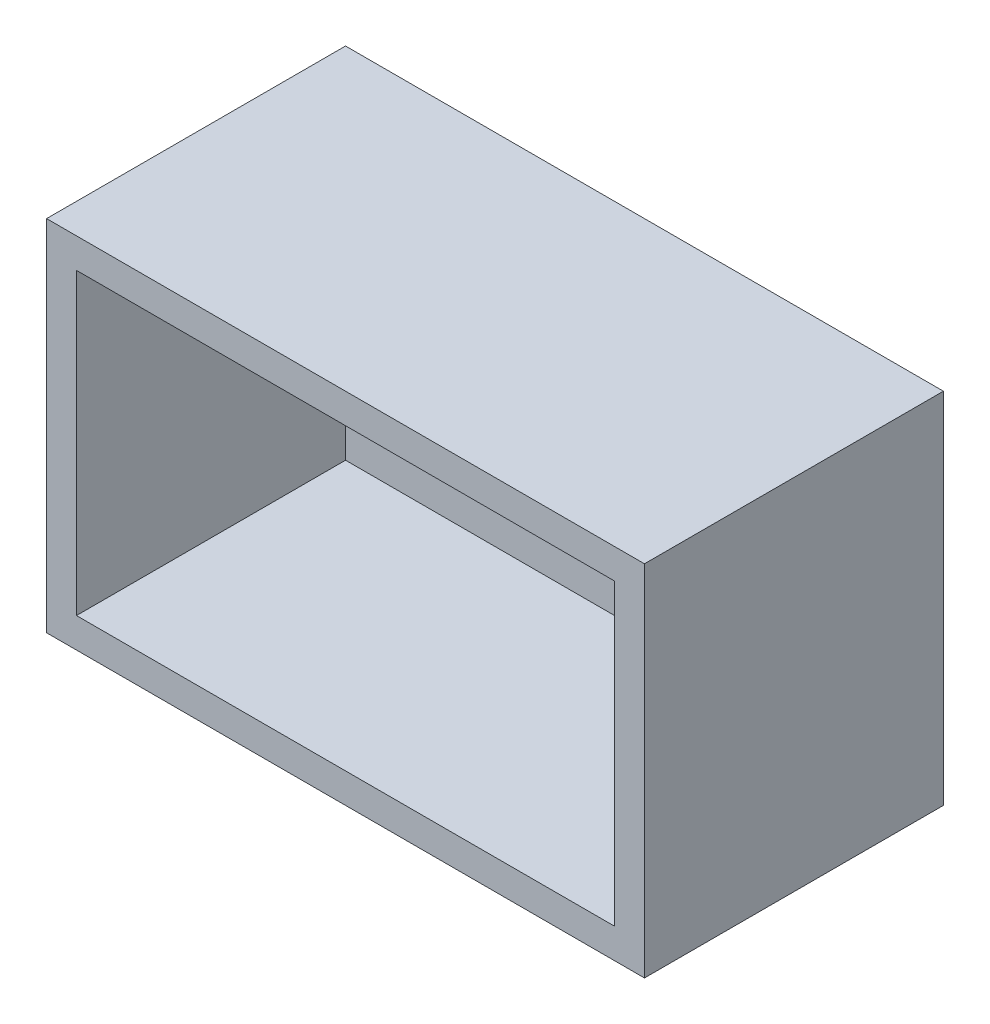
ISO-10303-21;
HEADER;
FILE_DESCRIPTION(('STEP AP214'),'2;1');
FILE_NAME('part.step','',(''),(''),'','','');
FILE_SCHEMA(('AUTOMOTIVE_DESIGN { 1 0 10303 214 1 1 1 1 }'));
ENDSEC;
DATA;
#1=APPLICATION_CONTEXT('core data for automotive mechanical design processes');
#2=APPLICATION_PROTOCOL_DEFINITION('international standard','automotive_design',2000,#1);
#3=PRODUCT_CONTEXT('',#1,'mechanical');
#4=PRODUCT('Part','Part','',(#3));
#5=PRODUCT_RELATED_PRODUCT_CATEGORY('part','',(#4));
#6=PRODUCT_DEFINITION_FORMATION('','',#4);
#7=PRODUCT_DEFINITION_CONTEXT('part definition',#1,'design');
#8=PRODUCT_DEFINITION('design','',#6,#7);
#9=PRODUCT_DEFINITION_SHAPE('','',#8);
#10=(LENGTH_UNIT() NAMED_UNIT(*) SI_UNIT(.MILLI.,.METRE.));
#11=(NAMED_UNIT(*) PLANE_ANGLE_UNIT() SI_UNIT($,.RADIAN.));
#12=(NAMED_UNIT(*) SI_UNIT($,.STERADIAN.) SOLID_ANGLE_UNIT());
#13=UNCERTAINTY_MEASURE_WITH_UNIT(LENGTH_MEASURE(1.E-05),#10,'distance_accuracy_value','');
#14=(GEOMETRIC_REPRESENTATION_CONTEXT(3) GLOBAL_UNCERTAINTY_ASSIGNED_CONTEXT((#13)) GLOBAL_UNIT_ASSIGNED_CONTEXT((#10,
#11,#12)) REPRESENTATION_CONTEXT('',''));
#15=CARTESIAN_POINT('',(0.,0.,0.));
#16=DIRECTION('',(0.,0.,1.));
#17=DIRECTION('',(1.,0.,0.));
#18=AXIS2_PLACEMENT_3D('',#15,#16,#17);
#19=CARTESIAN_POINT('',(-50.,30.,50.));
#20=DIRECTION('',(1.,0.,0.));
#21=DIRECTION('',(0.,0.,-1.));
#22=AXIS2_PLACEMENT_3D('',#19,#20,#21);
#23=PLANE('',#22);
#24=DIRECTION('',(0.,-1.,0.));
#25=VECTOR('',#24,1.);
#26=CARTESIAN_POINT('',(-50.,30.,0.));
#27=LINE('',#26,#25);
#28=CARTESIAN_POINT('',(-50.,30.,0.));
#29=VERTEX_POINT('',#28);
#30=CARTESIAN_POINT('',(-50.,-30.,0.));
#31=VERTEX_POINT('',#30);
#32=EDGE_CURVE('E180',#29,#31,#27,.T.);
#33=ORIENTED_EDGE('',*,*,#32,.T.);
#34=DIRECTION('',(0.,0.,-1.));
#35=VECTOR('',#34,1.);
#36=CARTESIAN_POINT('',(-50.,-30.,50.));
#37=LINE('',#36,#35);
#38=CARTESIAN_POINT('',(-50.,-30.,50.));
#39=VERTEX_POINT('',#38);
#40=EDGE_CURVE('E11',#39,#31,#37,.T.);
#41=ORIENTED_EDGE('',*,*,#40,.F.);
#42=DIRECTION('',(0.,-1.,0.));
#43=VECTOR('',#42,1.);
#44=CARTESIAN_POINT('',(-50.,30.,50.));
#45=LINE('',#44,#43);
#46=CARTESIAN_POINT('',(-50.,30.,50.));
#47=VERTEX_POINT('',#46);
#48=EDGE_CURVE('E169',#47,#39,#45,.T.);
#49=ORIENTED_EDGE('',*,*,#48,.F.);
#50=DIRECTION('',(0.,0.,-1.));
#51=VECTOR('',#50,1.);
#52=CARTESIAN_POINT('',(-50.,30.,50.));
#53=LINE('',#52,#51);
#54=EDGE_CURVE('E179',#47,#29,#53,.T.);
#55=ORIENTED_EDGE('',*,*,#54,.T.);
#56=EDGE_LOOP('',(#33,#41,#49,#55));
#57=FACE_BOUND('',#56,.T.);
#58=ADVANCED_FACE('F51',(#57),#23,.F.);
#59=CARTESIAN_POINT('',(-50.,-30.,50.));
#60=DIRECTION('',(0.,1.,0.));
#61=DIRECTION('',(0.,0.,1.));
#62=AXIS2_PLACEMENT_3D('',#59,#60,#61);
#63=PLANE('',#62);
#64=DIRECTION('',(1.,0.,0.));
#65=VECTOR('',#64,1.);
#66=CARTESIAN_POINT('',(-50.,-30.,0.));
#67=LINE('',#66,#65);
#68=CARTESIAN_POINT('',(50.,-30.,0.));
#69=VERTEX_POINT('',#68);
#70=EDGE_CURVE('E184',#31,#69,#67,.T.);
#71=ORIENTED_EDGE('',*,*,#70,.T.);
#72=DIRECTION('',(0.,0.,-1.));
#73=VECTOR('',#72,1.);
#74=CARTESIAN_POINT('',(50.,-30.,50.));
#75=LINE('',#74,#73);
#76=CARTESIAN_POINT('',(50.,-30.,50.));
#77=VERTEX_POINT('',#76);
#78=EDGE_CURVE('E59',#77,#69,#75,.T.);
#79=ORIENTED_EDGE('',*,*,#78,.F.);
#80=DIRECTION('',(1.,0.,0.));
#81=VECTOR('',#80,1.);
#82=CARTESIAN_POINT('',(-50.,-30.,50.));
#83=LINE('',#82,#81);
#84=EDGE_CURVE('E103',#39,#77,#83,.T.);
#85=ORIENTED_EDGE('',*,*,#84,.F.);
#86=ORIENTED_EDGE('',*,*,#40,.T.);
#87=EDGE_LOOP('',(#71,#79,#85,#86));
#88=FACE_BOUND('',#87,.T.);
#89=ADVANCED_FACE('F218',(#88),#63,.F.);
#90=CARTESIAN_POINT('',(50.,-30.,50.));
#91=DIRECTION('',(-1.,0.,0.));
#92=DIRECTION('',(0.,0.,1.));
#93=AXIS2_PLACEMENT_3D('',#90,#91,#92);
#94=PLANE('',#93);
#95=DIRECTION('',(0.,1.,0.));
#96=VECTOR('',#95,1.);
#97=CARTESIAN_POINT('',(50.,-30.,0.));
#98=LINE('',#97,#96);
#99=CARTESIAN_POINT('',(50.,30.,0.));
#100=VERTEX_POINT('',#99);
#101=EDGE_CURVE('E187',#69,#100,#98,.T.);
#102=ORIENTED_EDGE('',*,*,#101,.T.);
#103=DIRECTION('',(0.,0.,-1.));
#104=VECTOR('',#103,1.);
#105=CARTESIAN_POINT('',(50.,30.,50.));
#106=LINE('',#105,#104);
#107=CARTESIAN_POINT('',(50.,30.,50.));
#108=VERTEX_POINT('',#107);
#109=EDGE_CURVE('E194',#108,#100,#106,.T.);
#110=ORIENTED_EDGE('',*,*,#109,.F.);
#111=DIRECTION('',(0.,1.,0.));
#112=VECTOR('',#111,1.);
#113=CARTESIAN_POINT('',(50.,-30.,50.));
#114=LINE('',#113,#112);
#115=EDGE_CURVE('E174',#77,#108,#114,.T.);
#116=ORIENTED_EDGE('',*,*,#115,.F.);
#117=ORIENTED_EDGE('',*,*,#78,.T.);
#118=EDGE_LOOP('',(#102,#110,#116,#117));
#119=FACE_BOUND('',#118,.T.);
#120=ADVANCED_FACE('F201',(#119),#94,.F.);
#121=CARTESIAN_POINT('',(50.,30.,50.));
#122=DIRECTION('',(0.,-1.,0.));
#123=DIRECTION('',(0.,0.,-1.));
#124=AXIS2_PLACEMENT_3D('',#121,#122,#123);
#125=PLANE('',#124);
#126=DIRECTION('',(-1.,0.,0.));
#127=VECTOR('',#126,1.);
#128=CARTESIAN_POINT('',(50.,30.,0.));
#129=LINE('',#128,#127);
#130=EDGE_CURVE('E96',#100,#29,#129,.T.);
#131=ORIENTED_EDGE('',*,*,#130,.T.);
#132=ORIENTED_EDGE('',*,*,#54,.F.);
#133=DIRECTION('',(-1.,0.,0.));
#134=VECTOR('',#133,1.);
#135=CARTESIAN_POINT('',(50.,30.,50.));
#136=LINE('',#135,#134);
#137=EDGE_CURVE('E75',#108,#47,#136,.T.);
#138=ORIENTED_EDGE('',*,*,#137,.F.);
#139=ORIENTED_EDGE('',*,*,#109,.T.);
#140=EDGE_LOOP('',(#131,#132,#138,#139));
#141=FACE_BOUND('',#140,.T.);
#142=ADVANCED_FACE('F209',(#141),#125,.F.);
#143=CARTESIAN_POINT('',(0.,0.,50.));
#144=DIRECTION('',(0.,0.,1.));
#145=DIRECTION('',(1.,0.,0.));
#146=AXIS2_PLACEMENT_3D('',#143,#144,#145);
#147=PLANE('',#146);
#148=DIRECTION('',(0.,-1.,0.));
#149=VECTOR('',#148,1.);
#150=CARTESIAN_POINT('',(-45.,30.,50.));
#151=LINE('',#150,#149);
#152=CARTESIAN_POINT('',(-45.,25.,50.));
#153=VERTEX_POINT('',#152);
#154=CARTESIAN_POINT('',(-45.,-25.,50.));
#155=VERTEX_POINT('',#154);
#156=EDGE_CURVE('E153',#153,#155,#151,.T.);
#157=ORIENTED_EDGE('',*,*,#156,.F.);
#158=DIRECTION('',(-1.,0.,0.));
#159=VECTOR('',#158,1.);
#160=CARTESIAN_POINT('',(50.,25.,50.));
#161=LINE('',#160,#159);
#162=CARTESIAN_POINT('',(45.,25.,50.));
#163=VERTEX_POINT('',#162);
#164=EDGE_CURVE('E166',#163,#153,#161,.T.);
#165=ORIENTED_EDGE('',*,*,#164,.F.);
#166=DIRECTION('',(0.,1.,0.));
#167=VECTOR('',#166,1.);
#168=CARTESIAN_POINT('',(45.,-30.,50.));
#169=LINE('',#168,#167);
#170=CARTESIAN_POINT('',(45.,-25.,50.));
#171=VERTEX_POINT('',#170);
#172=EDGE_CURVE('E163',#171,#163,#169,.T.);
#173=ORIENTED_EDGE('',*,*,#172,.F.);
#174=DIRECTION('',(1.,0.,0.));
#175=VECTOR('',#174,1.);
#176=CARTESIAN_POINT('',(-50.,-25.,50.));
#177=LINE('',#176,#175);
#178=EDGE_CURVE('E141',#155,#171,#177,.T.);
#179=ORIENTED_EDGE('',*,*,#178,.F.);
#180=EDGE_LOOP('',(#157,#165,#173,#179));
#181=FACE_BOUND('',#180,.T.);
#182=ORIENTED_EDGE('',*,*,#48,.T.);
#183=ORIENTED_EDGE('',*,*,#84,.T.);
#184=ORIENTED_EDGE('',*,*,#115,.T.);
#185=ORIENTED_EDGE('',*,*,#137,.T.);
#186=EDGE_LOOP('',(#182,#183,#184,#185));
#187=FACE_BOUND('',#186,.T.);
#188=ADVANCED_FACE('F211',(#181,#187),#147,.T.);
#189=CARTESIAN_POINT('',(0.,0.,0.));
#190=DIRECTION('',(0.,0.,1.));
#191=DIRECTION('',(1.,0.,0.));
#192=AXIS2_PLACEMENT_3D('',#189,#190,#191);
#193=PLANE('',#192);
#194=ORIENTED_EDGE('',*,*,#32,.F.);
#195=ORIENTED_EDGE('',*,*,#130,.F.);
#196=ORIENTED_EDGE('',*,*,#101,.F.);
#197=ORIENTED_EDGE('',*,*,#70,.F.);
#198=EDGE_LOOP('',(#194,#195,#196,#197));
#199=FACE_BOUND('',#198,.T.);
#200=ADVANCED_FACE('F205',(#199),#193,.F.);
#201=CARTESIAN_POINT('',(-45.,30.,50.));
#202=DIRECTION('',(1.,0.,0.));
#203=DIRECTION('',(0.,0.,-1.));
#204=AXIS2_PLACEMENT_3D('',#201,#202,#203);
#205=PLANE('',#204);
#206=DIRECTION('',(0.,-1.,0.));
#207=VECTOR('',#206,1.);
#208=CARTESIAN_POINT('',(-45.,30.,5.));
#209=LINE('',#208,#207);
#210=CARTESIAN_POINT('',(-45.,25.,5.));
#211=VERTEX_POINT('',#210);
#212=CARTESIAN_POINT('',(-45.,-25.,5.));
#213=VERTEX_POINT('',#212);
#214=EDGE_CURVE('E131',#211,#213,#209,.T.);
#215=ORIENTED_EDGE('',*,*,#214,.F.);
#216=DIRECTION('',(0.,0.,-1.));
#217=VECTOR('',#216,1.);
#218=CARTESIAN_POINT('',(-45.,25.,50.));
#219=LINE('',#218,#217);
#220=EDGE_CURVE('E157',#153,#211,#219,.T.);
#221=ORIENTED_EDGE('',*,*,#220,.F.);
#222=ORIENTED_EDGE('',*,*,#156,.T.);
#223=DIRECTION('',(0.,0.,-1.));
#224=VECTOR('',#223,1.);
#225=CARTESIAN_POINT('',(-45.,-25.,50.));
#226=LINE('',#225,#224);
#227=EDGE_CURVE('E145',#155,#213,#226,.T.);
#228=ORIENTED_EDGE('',*,*,#227,.T.);
#229=EDGE_LOOP('',(#215,#221,#222,#228));
#230=FACE_BOUND('',#229,.T.);
#231=ADVANCED_FACE('F233',(#230),#205,.T.);
#232=CARTESIAN_POINT('',(-50.,-25.,50.));
#233=DIRECTION('',(0.,1.,0.));
#234=DIRECTION('',(0.,0.,1.));
#235=AXIS2_PLACEMENT_3D('',#232,#233,#234);
#236=PLANE('',#235);
#237=DIRECTION('',(1.,0.,0.));
#238=VECTOR('',#237,1.);
#239=CARTESIAN_POINT('',(-50.,-25.,5.));
#240=LINE('',#239,#238);
#241=CARTESIAN_POINT('',(45.,-25.,5.));
#242=VERTEX_POINT('',#241);
#243=EDGE_CURVE('E125',#213,#242,#240,.T.);
#244=ORIENTED_EDGE('',*,*,#243,.F.);
#245=ORIENTED_EDGE('',*,*,#227,.F.);
#246=ORIENTED_EDGE('',*,*,#178,.T.);
#247=DIRECTION('',(0.,0.,-1.));
#248=VECTOR('',#247,1.);
#249=CARTESIAN_POINT('',(45.,-25.,50.));
#250=LINE('',#249,#248);
#251=EDGE_CURVE('E138',#171,#242,#250,.T.);
#252=ORIENTED_EDGE('',*,*,#251,.T.);
#253=EDGE_LOOP('',(#244,#245,#246,#252));
#254=FACE_BOUND('',#253,.T.);
#255=ADVANCED_FACE('F139',(#254),#236,.T.);
#256=CARTESIAN_POINT('',(45.,-30.,50.));
#257=DIRECTION('',(-1.,0.,0.));
#258=DIRECTION('',(0.,0.,1.));
#259=AXIS2_PLACEMENT_3D('',#256,#257,#258);
#260=PLANE('',#259);
#261=DIRECTION('',(0.,1.,0.));
#262=VECTOR('',#261,1.);
#263=CARTESIAN_POINT('',(45.,-30.,5.));
#264=LINE('',#263,#262);
#265=CARTESIAN_POINT('',(45.,25.,5.));
#266=VERTEX_POINT('',#265);
#267=EDGE_CURVE('E129',#242,#266,#264,.T.);
#268=ORIENTED_EDGE('',*,*,#267,.F.);
#269=ORIENTED_EDGE('',*,*,#251,.F.);
#270=ORIENTED_EDGE('',*,*,#172,.T.);
#271=DIRECTION('',(0.,0.,-1.));
#272=VECTOR('',#271,1.);
#273=CARTESIAN_POINT('',(45.,25.,50.));
#274=LINE('',#273,#272);
#275=EDGE_CURVE('E66',#163,#266,#274,.T.);
#276=ORIENTED_EDGE('',*,*,#275,.T.);
#277=EDGE_LOOP('',(#268,#269,#270,#276));
#278=FACE_BOUND('',#277,.T.);
#279=ADVANCED_FACE('F147',(#278),#260,.T.);
#280=CARTESIAN_POINT('',(50.,25.,50.));
#281=DIRECTION('',(0.,-1.,0.));
#282=DIRECTION('',(0.,0.,-1.));
#283=AXIS2_PLACEMENT_3D('',#280,#281,#282);
#284=PLANE('',#283);
#285=DIRECTION('',(-1.,0.,0.));
#286=VECTOR('',#285,1.);
#287=CARTESIAN_POINT('',(50.,25.,5.));
#288=LINE('',#287,#286);
#289=EDGE_CURVE('E149',#266,#211,#288,.T.);
#290=ORIENTED_EDGE('',*,*,#289,.F.);
#291=ORIENTED_EDGE('',*,*,#275,.F.);
#292=ORIENTED_EDGE('',*,*,#164,.T.);
#293=ORIENTED_EDGE('',*,*,#220,.T.);
#294=EDGE_LOOP('',(#290,#291,#292,#293));
#295=FACE_BOUND('',#294,.T.);
#296=ADVANCED_FACE('F240',(#295),#284,.T.);
#297=CARTESIAN_POINT('',(0.,0.,5.));
#298=DIRECTION('',(0.,0.,1.));
#299=DIRECTION('',(1.,0.,0.));
#300=AXIS2_PLACEMENT_3D('',#297,#298,#299);
#301=PLANE('',#300);
#302=ORIENTED_EDGE('',*,*,#214,.T.);
#303=ORIENTED_EDGE('',*,*,#243,.T.);
#304=ORIENTED_EDGE('',*,*,#267,.T.);
#305=ORIENTED_EDGE('',*,*,#289,.T.);
#306=EDGE_LOOP('',(#302,#303,#304,#305));
#307=FACE_BOUND('',#306,.T.);
#308=ADVANCED_FACE('F127',(#307),#301,.T.);
#309=CLOSED_SHELL('',(#58,#89,#120,#142,#188,#200,#231,#255,#279,#296,#308));
#310=MANIFOLD_SOLID_BREP('B2',#309);
#311=ADVANCED_BREP_SHAPE_REPRESENTATION('',(#18,#310),#14);
#312=SHAPE_DEFINITION_REPRESENTATION(#9,#311);
ENDSEC;
END-ISO-10303-21;
